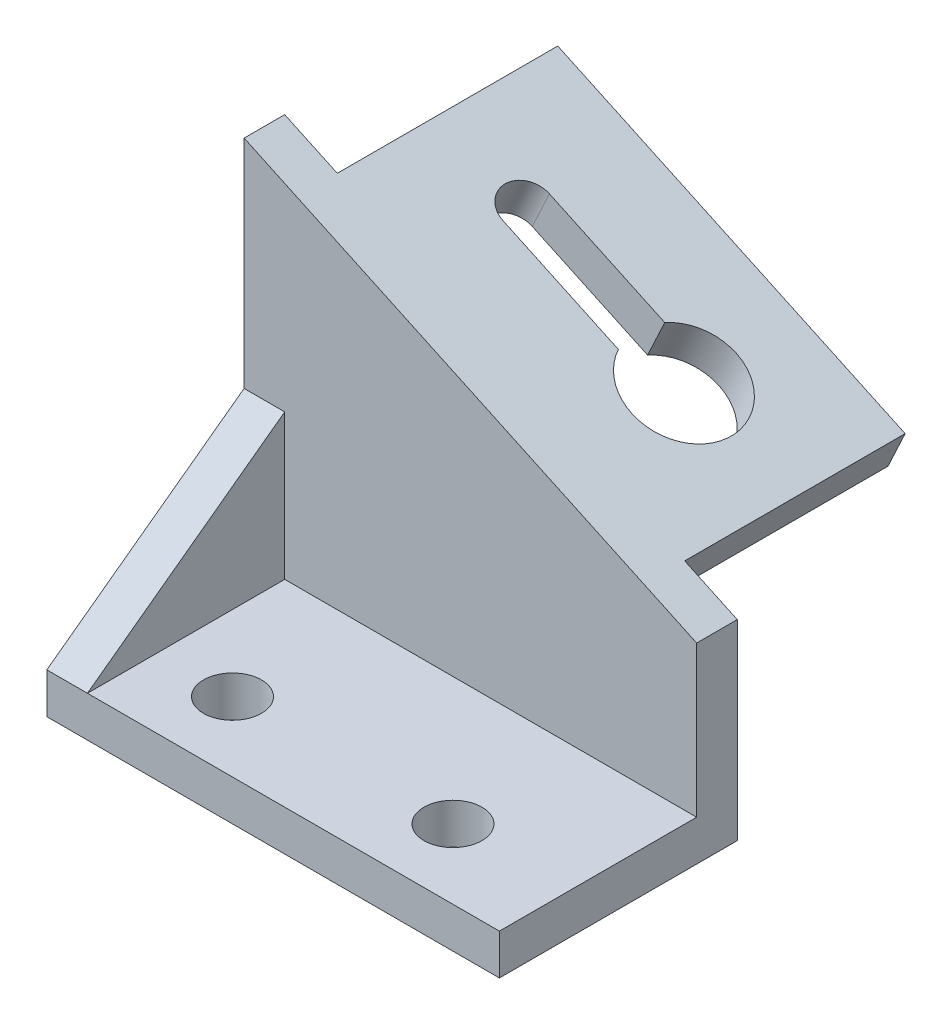
ISO-10303-21;
HEADER;
FILE_DESCRIPTION(('STEP AP214'),'2;1');
FILE_NAME('part.step','',(''),(''),'','','');
FILE_SCHEMA(('AUTOMOTIVE_DESIGN { 1 0 10303 214 1 1 1 1 }'));
ENDSEC;
DATA;
#1=APPLICATION_CONTEXT('core data for automotive mechanical design processes');
#2=APPLICATION_PROTOCOL_DEFINITION('international standard','automotive_design',2000,#1);
#3=PRODUCT_CONTEXT('',#1,'mechanical');
#4=PRODUCT('Part','Part','',(#3));
#5=PRODUCT_RELATED_PRODUCT_CATEGORY('part','',(#4));
#6=PRODUCT_DEFINITION_FORMATION('','',#4);
#7=PRODUCT_DEFINITION_CONTEXT('part definition',#1,'design');
#8=PRODUCT_DEFINITION('design','',#6,#7);
#9=PRODUCT_DEFINITION_SHAPE('','',#8);
#10=(LENGTH_UNIT() NAMED_UNIT(*) SI_UNIT(.MILLI.,.METRE.));
#11=(NAMED_UNIT(*) PLANE_ANGLE_UNIT() SI_UNIT($,.RADIAN.));
#12=(NAMED_UNIT(*) SI_UNIT($,.STERADIAN.) SOLID_ANGLE_UNIT());
#13=UNCERTAINTY_MEASURE_WITH_UNIT(LENGTH_MEASURE(1.E-05),#10,'distance_accuracy_value','');
#14=(GEOMETRIC_REPRESENTATION_CONTEXT(3) GLOBAL_UNCERTAINTY_ASSIGNED_CONTEXT((#13)) GLOBAL_UNIT_ASSIGNED_CONTEXT((#10,
#11,#12)) REPRESENTATION_CONTEXT('',''));
#15=CARTESIAN_POINT('',(0.,0.,0.));
#16=DIRECTION('',(0.,0.,1.));
#17=DIRECTION('',(1.,0.,0.));
#18=AXIS2_PLACEMENT_3D('',#15,#16,#17);
#19=CARTESIAN_POINT('',(0.,7.,-41.));
#20=DIRECTION('',(0.,0.,1.));
#21=DIRECTION('',(1.,0.,0.));
#22=AXIS2_PLACEMENT_3D('',#19,#20,#21);
#23=PLANE('',#22);
#24=DIRECTION('',(0.422618261740693,0.906307787036653,0.));
#25=VECTOR('',#24,1.);
#26=CARTESIAN_POINT('',(6.10475003818167,58.8016602094258,-41.));
#27=LINE('',#26,#25);
#28=CARTESIAN_POINT('',(6.10475003818167,58.8016602094258,-41.));
#29=VERTEX_POINT('',#28);
#30=CARTESIAN_POINT('',(9.06307787036652,65.1458147186824,-41.));
#31=VERTEX_POINT('',#30);
#32=EDGE_CURVE('E228',#29,#31,#27,.T.);
#33=ORIENTED_EDGE('',*,*,#32,.F.);
#34=DIRECTION('',(-0.906307787036653,0.422618261740693,0.));
#35=VECTOR('',#34,1.);
#36=CARTESIAN_POINT('',(23.6126887015027,50.6375743322113,-41.));
#37=LINE('',#36,#35);
#38=CARTESIAN_POINT('',(65.9785942974486,30.8820281081504,-41.));
#39=VERTEX_POINT('',#38);
#40=EDGE_CURVE('E198',#39,#29,#37,.T.);
#41=ORIENTED_EDGE('',*,*,#40,.F.);
#42=DIRECTION('',(0.422618261740693,0.906307787036653,0.));
#43=VECTOR('',#42,1.);
#44=CARTESIAN_POINT('',(65.9785942974486,30.8820281081504,-41.));
#45=LINE('',#44,#43);
#46=CARTESIAN_POINT('',(68.9369221296335,37.2261826174069,-41.));
#47=VERTEX_POINT('',#46);
#48=EDGE_CURVE('E240',#39,#47,#45,.T.);
#49=ORIENTED_EDGE('',*,*,#48,.T.);
#50=DIRECTION('',(-0.906307787036653,0.422618261740693,0.));
#51=VECTOR('',#50,1.);
#52=CARTESIAN_POINT('',(23.8898609827712,58.231972207565,-41.));
#53=LINE('',#52,#51);
#54=CARTESIAN_POINT('',(78.,33.,-41.));
#55=VERTEX_POINT('',#54);
#56=EDGE_CURVE('E255',#55,#47,#53,.T.);
#57=ORIENTED_EDGE('',*,*,#56,.F.);
#58=DIRECTION('',(0.,-1.,0.));
#59=VECTOR('',#58,1.);
#60=CARTESIAN_POINT('',(78.,7.,-41.));
#61=LINE('',#60,#59);
#62=CARTESIAN_POINT('',(78.,0.,-41.));
#63=VERTEX_POINT('',#62);
#64=EDGE_CURVE('E334',#55,#63,#61,.T.);
#65=ORIENTED_EDGE('',*,*,#64,.T.);
#66=DIRECTION('',(-1.,0.,0.));
#67=VECTOR('',#66,1.);
#68=CARTESIAN_POINT('',(0.,0.,-41.));
#69=LINE('',#68,#67);
#70=CARTESIAN_POINT('',(0.,0.,-41.));
#71=VERTEX_POINT('',#70);
#72=EDGE_CURVE('E328',#63,#71,#69,.T.);
#73=ORIENTED_EDGE('',*,*,#72,.T.);
#74=DIRECTION('',(0.,-1.,0.));
#75=VECTOR('',#74,1.);
#76=CARTESIAN_POINT('',(0.,7.,-41.));
#77=LINE('',#76,#75);
#78=CARTESIAN_POINT('',(0.,69.3719973360893,-41.));
#79=VERTEX_POINT('',#78);
#80=EDGE_CURVE('E319',#79,#71,#77,.T.);
#81=ORIENTED_EDGE('',*,*,#80,.F.);
#82=EDGE_CURVE('E232',#31,#79,#53,.T.);
#83=ORIENTED_EDGE('',*,*,#82,.F.);
#84=EDGE_LOOP('',(#33,#41,#49,#57,#65,#73,#81,#83));
#85=FACE_BOUND('',#84,.T.);
#86=ADVANCED_FACE('F45',(#85),#23,.F.);
#87=CARTESIAN_POINT('',(0.,7.,0.));
#88=DIRECTION('',(0.,-1.,0.));
#89=DIRECTION('',(0.,0.,-1.));
#90=AXIS2_PLACEMENT_3D('',#87,#88,#89);
#91=PLANE('',#90);
#92=CARTESIAN_POINT('',(58.,7.,-12.));
#93=DIRECTION('',(0.,1.,0.));
#94=DIRECTION('',(0.,0.,1.));
#95=AXIS2_PLACEMENT_3D('',#92,#93,#94);
#96=CIRCLE('',#95,5.);
#97=CARTESIAN_POINT('',(58.,7.,-7.));
#98=VERTEX_POINT('',#97);
#99=EDGE_CURVE('E294',#98,#98,#96,.T.);
#100=ORIENTED_EDGE('',*,*,#99,.F.);
#101=EDGE_LOOP('',(#100));
#102=FACE_BOUND('',#101,.T.);
#103=CARTESIAN_POINT('',(20.,7.,-12.));
#104=DIRECTION('',(0.,1.,0.));
#105=DIRECTION('',(0.,0.,1.));
#106=AXIS2_PLACEMENT_3D('',#103,#104,#105);
#107=CIRCLE('',#106,5.);
#108=CARTESIAN_POINT('',(20.,7.,-7.));
#109=VERTEX_POINT('',#108);
#110=EDGE_CURVE('E302',#109,#109,#107,.T.);
#111=ORIENTED_EDGE('',*,*,#110,.F.);
#112=EDGE_LOOP('',(#111));
#113=FACE_BOUND('',#112,.T.);
#114=DIRECTION('',(0.,0.,-1.));
#115=VECTOR('',#114,1.);
#116=CARTESIAN_POINT('',(78.,7.,0.));
#117=LINE('',#116,#115);
#118=CARTESIAN_POINT('',(78.,7.,0.));
#119=VERTEX_POINT('',#118);
#120=CARTESIAN_POINT('',(78.,7.,-34.));
#121=VERTEX_POINT('',#120);
#122=EDGE_CURVE('E314',#119,#121,#117,.T.);
#123=ORIENTED_EDGE('',*,*,#122,.T.);
#124=DIRECTION('',(-1.,0.,0.));
#125=VECTOR('',#124,1.);
#126=CARTESIAN_POINT('',(0.,7.,-34.));
#127=LINE('',#126,#125);
#128=CARTESIAN_POINT('',(7.,7.,-34.));
#129=VERTEX_POINT('',#128);
#130=EDGE_CURVE('E272',#121,#129,#127,.T.);
#131=ORIENTED_EDGE('',*,*,#130,.T.);
#132=DIRECTION('',(0.,0.,-1.));
#133=VECTOR('',#132,1.);
#134=CARTESIAN_POINT('',(7.,7.,-34.));
#135=LINE('',#134,#133);
#136=CARTESIAN_POINT('',(7.,7.,0.));
#137=VERTEX_POINT('',#136);
#138=EDGE_CURVE('E69',#137,#129,#135,.T.);
#139=ORIENTED_EDGE('',*,*,#138,.F.);
#140=DIRECTION('',(1.,0.,0.));
#141=VECTOR('',#140,1.);
#142=CARTESIAN_POINT('',(0.,7.,0.));
#143=LINE('',#142,#141);
#144=EDGE_CURVE('E315',#137,#119,#143,.T.);
#145=ORIENTED_EDGE('',*,*,#144,.T.);
#146=EDGE_LOOP('',(#123,#131,#139,#145));
#147=FACE_BOUND('',#146,.T.);
#148=ADVANCED_FACE('F368',(#102,#113,#147),#91,.F.);
#149=CARTESIAN_POINT('',(0.,0.,0.));
#150=DIRECTION('',(0.,-1.,0.));
#151=DIRECTION('',(0.,0.,-1.));
#152=AXIS2_PLACEMENT_3D('',#149,#150,#151);
#153=PLANE('',#152);
#154=DIRECTION('',(1.,0.,0.));
#155=VECTOR('',#154,1.);
#156=CARTESIAN_POINT('',(0.,0.,0.));
#157=LINE('',#156,#155);
#158=CARTESIAN_POINT('',(0.,0.,0.));
#159=VERTEX_POINT('',#158);
#160=CARTESIAN_POINT('',(78.,0.,0.));
#161=VERTEX_POINT('',#160);
#162=EDGE_CURVE('E322',#159,#161,#157,.T.);
#163=ORIENTED_EDGE('',*,*,#162,.F.);
#164=DIRECTION('',(0.,0.,1.));
#165=VECTOR('',#164,1.);
#166=CARTESIAN_POINT('',(0.,0.,0.));
#167=LINE('',#166,#165);
#168=EDGE_CURVE('E306',#71,#159,#167,.T.);
#169=ORIENTED_EDGE('',*,*,#168,.F.);
#170=ORIENTED_EDGE('',*,*,#72,.F.);
#171=DIRECTION('',(0.,0.,-1.));
#172=VECTOR('',#171,1.);
#173=CARTESIAN_POINT('',(78.,0.,0.));
#174=LINE('',#173,#172);
#175=EDGE_CURVE('E325',#161,#63,#174,.T.);
#176=ORIENTED_EDGE('',*,*,#175,.F.);
#177=EDGE_LOOP('',(#163,#169,#170,#176));
#178=FACE_BOUND('',#177,.T.);
#179=CARTESIAN_POINT('',(20.,0.,-12.));
#180=DIRECTION('',(0.,1.,0.));
#181=DIRECTION('',(0.,0.,1.));
#182=AXIS2_PLACEMENT_3D('',#179,#180,#181);
#183=CIRCLE('',#182,5.);
#184=CARTESIAN_POINT('',(20.,0.,-7.));
#185=VERTEX_POINT('',#184);
#186=EDGE_CURVE('E298',#185,#185,#183,.T.);
#187=ORIENTED_EDGE('',*,*,#186,.T.);
#188=EDGE_LOOP('',(#187));
#189=FACE_BOUND('',#188,.T.);
#190=CARTESIAN_POINT('',(58.,0.,-12.));
#191=DIRECTION('',(0.,1.,0.));
#192=DIRECTION('',(0.,0.,1.));
#193=AXIS2_PLACEMENT_3D('',#190,#191,#192);
#194=CIRCLE('',#193,5.);
#195=CARTESIAN_POINT('',(58.,0.,-7.));
#196=VERTEX_POINT('',#195);
#197=EDGE_CURVE('E293',#196,#196,#194,.T.);
#198=ORIENTED_EDGE('',*,*,#197,.T.);
#199=EDGE_LOOP('',(#198));
#200=FACE_BOUND('',#199,.T.);
#201=ADVANCED_FACE('F349',(#178,#189,#200),#153,.T.);
#202=CARTESIAN_POINT('',(0.,7.,0.));
#203=DIRECTION('',(1.,0.,0.));
#204=DIRECTION('',(0.,0.,-1.));
#205=AXIS2_PLACEMENT_3D('',#202,#203,#204);
#206=PLANE('',#205);
#207=DIRECTION('',(0.,-0.592390450477518,0.805651012649425));
#208=VECTOR('',#207,1.);
#209=CARTESIAN_POINT('',(0.,7.,0.));
#210=LINE('',#209,#208);
#211=CARTESIAN_POINT('',(0.,32.,-34.));
#212=VERTEX_POINT('',#211);
#213=CARTESIAN_POINT('',(0.,7.,0.));
#214=VERTEX_POINT('',#213);
#215=EDGE_CURVE('E275',#212,#214,#210,.T.);
#216=ORIENTED_EDGE('',*,*,#215,.F.);
#217=DIRECTION('',(0.,-1.,0.));
#218=VECTOR('',#217,1.);
#219=CARTESIAN_POINT('',(0.,7.,-34.));
#220=LINE('',#219,#218);
#221=CARTESIAN_POINT('',(0.,69.3719973360893,-34.));
#222=VERTEX_POINT('',#221);
#223=EDGE_CURVE('E254',#222,#212,#220,.T.);
#224=ORIENTED_EDGE('',*,*,#223,.F.);
#225=DIRECTION('',(0.,0.,-1.));
#226=VECTOR('',#225,1.);
#227=CARTESIAN_POINT('',(0.,69.3719973360893,-34.));
#228=LINE('',#227,#226);
#229=EDGE_CURVE('E268',#222,#79,#228,.T.);
#230=ORIENTED_EDGE('',*,*,#229,.T.);
#231=ORIENTED_EDGE('',*,*,#80,.T.);
#232=ORIENTED_EDGE('',*,*,#168,.T.);
#233=DIRECTION('',(0.,-1.,0.));
#234=VECTOR('',#233,1.);
#235=CARTESIAN_POINT('',(0.,7.,0.));
#236=LINE('',#235,#234);
#237=EDGE_CURVE('E11',#214,#159,#236,.T.);
#238=ORIENTED_EDGE('',*,*,#237,.F.);
#239=EDGE_LOOP('',(#216,#224,#230,#231,#232,#238));
#240=FACE_BOUND('',#239,.T.);
#241=ADVANCED_FACE('F47',(#240),#206,.F.);
#242=CARTESIAN_POINT('',(0.,7.,0.));
#243=DIRECTION('',(0.,0.,-1.));
#244=DIRECTION('',(-1.,0.,0.));
#245=AXIS2_PLACEMENT_3D('',#242,#243,#244);
#246=PLANE('',#245);
#247=ORIENTED_EDGE('',*,*,#162,.T.);
#248=DIRECTION('',(0.,-1.,0.));
#249=VECTOR('',#248,1.);
#250=CARTESIAN_POINT('',(78.,7.,0.));
#251=LINE('',#250,#249);
#252=EDGE_CURVE('E54',#119,#161,#251,.T.);
#253=ORIENTED_EDGE('',*,*,#252,.F.);
#254=ORIENTED_EDGE('',*,*,#144,.F.);
#255=EDGE_CURVE('E310',#214,#137,#143,.T.);
#256=ORIENTED_EDGE('',*,*,#255,.F.);
#257=ORIENTED_EDGE('',*,*,#237,.T.);
#258=EDGE_LOOP('',(#247,#253,#254,#256,#257));
#259=FACE_BOUND('',#258,.T.);
#260=ADVANCED_FACE('F369',(#259),#246,.F.);
#261=CARTESIAN_POINT('',(78.,7.,0.));
#262=DIRECTION('',(-1.,0.,0.));
#263=DIRECTION('',(0.,0.,1.));
#264=AXIS2_PLACEMENT_3D('',#261,#262,#263);
#265=PLANE('',#264);
#266=ORIENTED_EDGE('',*,*,#175,.T.);
#267=ORIENTED_EDGE('',*,*,#64,.F.);
#268=DIRECTION('',(0.,0.,-1.));
#269=VECTOR('',#268,1.);
#270=CARTESIAN_POINT('',(78.,33.,-34.));
#271=LINE('',#270,#269);
#272=CARTESIAN_POINT('',(78.,33.,-34.));
#273=VERTEX_POINT('',#272);
#274=EDGE_CURVE('E261',#273,#55,#271,.T.);
#275=ORIENTED_EDGE('',*,*,#274,.F.);
#276=DIRECTION('',(0.,1.,0.));
#277=VECTOR('',#276,1.);
#278=CARTESIAN_POINT('',(78.,7.,-34.));
#279=LINE('',#278,#277);
#280=EDGE_CURVE('E258',#121,#273,#279,.T.);
#281=ORIENTED_EDGE('',*,*,#280,.F.);
#282=ORIENTED_EDGE('',*,*,#122,.F.);
#283=ORIENTED_EDGE('',*,*,#252,.T.);
#284=EDGE_LOOP('',(#266,#267,#275,#281,#282,#283));
#285=FACE_BOUND('',#284,.T.);
#286=ADVANCED_FACE('F343',(#285),#265,.F.);
#287=CARTESIAN_POINT('',(20.,7.,-12.));
#288=DIRECTION('',(0.,-1.,0.));
#289=DIRECTION('',(0.,0.,-1.));
#290=AXIS2_PLACEMENT_3D('',#287,#288,#289);
#291=CYLINDRICAL_SURFACE('',#290,5.);
#292=ORIENTED_EDGE('',*,*,#110,.T.);
#293=EDGE_LOOP('',(#292));
#294=FACE_BOUND('',#293,.T.);
#295=ORIENTED_EDGE('',*,*,#186,.F.);
#296=EDGE_LOOP('',(#295));
#297=FACE_BOUND('',#296,.T.);
#298=ADVANCED_FACE('F408',(#294,#297),#291,.F.);
#299=CARTESIAN_POINT('',(58.,7.,-12.));
#300=DIRECTION('',(0.,-1.,0.));
#301=DIRECTION('',(0.,0.,-1.));
#302=AXIS2_PLACEMENT_3D('',#299,#300,#301);
#303=CYLINDRICAL_SURFACE('',#302,5.);
#304=ORIENTED_EDGE('',*,*,#99,.T.);
#305=EDGE_LOOP('',(#304));
#306=FACE_BOUND('',#305,.T.);
#307=ORIENTED_EDGE('',*,*,#197,.F.);
#308=EDGE_LOOP('',(#307));
#309=FACE_BOUND('',#308,.T.);
#310=ADVANCED_FACE('F433',(#306,#309),#303,.F.);
#311=CARTESIAN_POINT('',(7.,7.,0.));
#312=DIRECTION('',(0.,-0.805651012649424,-0.592390450477518));
#313=DIRECTION('',(0.,0.592390450477518,-0.805651012649425));
#314=AXIS2_PLACEMENT_3D('',#311,#312,#313);
#315=PLANE('',#314);
#316=ORIENTED_EDGE('',*,*,#215,.T.);
#317=ORIENTED_EDGE('',*,*,#255,.T.);
#318=DIRECTION('',(0.,-0.592390450477518,0.805651012649425));
#319=VECTOR('',#318,1.);
#320=CARTESIAN_POINT('',(7.,7.,0.));
#321=LINE('',#320,#319);
#322=CARTESIAN_POINT('',(7.,32.,-34.));
#323=VERTEX_POINT('',#322);
#324=EDGE_CURVE('E282',#323,#137,#321,.T.);
#325=ORIENTED_EDGE('',*,*,#324,.F.);
#326=DIRECTION('',(-1.,0.,0.));
#327=VECTOR('',#326,1.);
#328=CARTESIAN_POINT('',(7.,32.,-34.));
#329=LINE('',#328,#327);
#330=EDGE_CURVE('E286',#323,#212,#329,.T.);
#331=ORIENTED_EDGE('',*,*,#330,.T.);
#332=EDGE_LOOP('',(#316,#317,#325,#331));
#333=FACE_BOUND('',#332,.T.);
#334=ADVANCED_FACE('F374',(#333),#315,.F.);
#335=CARTESIAN_POINT('',(7.,0.,0.));
#336=DIRECTION('',(1.,0.,0.));
#337=DIRECTION('',(0.,0.,-1.));
#338=AXIS2_PLACEMENT_3D('',#335,#336,#337);
#339=PLANE('',#338);
#340=ORIENTED_EDGE('',*,*,#138,.T.);
#341=DIRECTION('',(0.,1.,0.));
#342=VECTOR('',#341,1.);
#343=CARTESIAN_POINT('',(7.,32.,-34.));
#344=LINE('',#343,#342);
#345=EDGE_CURVE('E278',#129,#323,#344,.T.);
#346=ORIENTED_EDGE('',*,*,#345,.T.);
#347=ORIENTED_EDGE('',*,*,#324,.T.);
#348=EDGE_LOOP('',(#340,#346,#347));
#349=FACE_BOUND('',#348,.T.);
#350=ADVANCED_FACE('F372',(#349),#339,.T.);
#351=CARTESIAN_POINT('',(0.,0.,-34.));
#352=DIRECTION('',(0.,0.,1.));
#353=DIRECTION('',(1.,0.,0.));
#354=AXIS2_PLACEMENT_3D('',#351,#352,#353);
#355=PLANE('',#354);
#356=ORIENTED_EDGE('',*,*,#130,.F.);
#357=ORIENTED_EDGE('',*,*,#280,.T.);
#358=DIRECTION('',(-0.906307787036653,0.422618261740693,0.));
#359=VECTOR('',#358,1.);
#360=CARTESIAN_POINT('',(23.8898609827712,58.231972207565,-34.));
#361=LINE('',#360,#359);
#362=EDGE_CURVE('E250',#273,#222,#361,.T.);
#363=ORIENTED_EDGE('',*,*,#362,.T.);
#364=ORIENTED_EDGE('',*,*,#223,.T.);
#365=ORIENTED_EDGE('',*,*,#330,.F.);
#366=ORIENTED_EDGE('',*,*,#345,.F.);
#367=EDGE_LOOP('',(#356,#357,#363,#364,#365,#366));
#368=FACE_BOUND('',#367,.T.);
#369=ADVANCED_FACE('F376',(#368),#355,.T.);
#370=CARTESIAN_POINT('',(23.8898609827712,58.231972207565,-34.));
#371=DIRECTION('',(-0.422618261740693,-0.906307787036653,0.));
#372=DIRECTION('',(0.906307787036653,-0.422618261740693,0.));
#373=AXIS2_PLACEMENT_3D('',#370,#371,#372);
#374=PLANE('',#373);
#375=ORIENTED_EDGE('',*,*,#56,.T.);
#376=DIRECTION('',(0.,0.,-1.));
#377=VECTOR('',#376,1.);
#378=CARTESIAN_POINT('',(68.9369221296335,37.226182617407,0.));
#379=LINE('',#378,#377);
#380=CARTESIAN_POINT('',(68.9369221296335,37.226182617407,-79.));
#381=VERTEX_POINT('',#380);
#382=EDGE_CURVE('E61',#47,#381,#379,.T.);
#383=ORIENTED_EDGE('',*,*,#382,.T.);
#384=DIRECTION('',(0.906307787036653,-0.422618261740693,0.));
#385=VECTOR('',#384,1.);
#386=CARTESIAN_POINT('',(26.5710165336876,56.9817288414679,-79.));
#387=LINE('',#386,#385);
#388=CARTESIAN_POINT('',(9.06307787036654,65.1458147186823,-79.));
#389=VERTEX_POINT('',#388);
#390=EDGE_CURVE('E190',#389,#381,#387,.T.);
#391=ORIENTED_EDGE('',*,*,#390,.F.);
#392=DIRECTION('',(0.,0.,-1.));
#393=VECTOR('',#392,1.);
#394=CARTESIAN_POINT('',(9.06307787036653,65.1458147186823,0.));
#395=LINE('',#394,#393);
#396=EDGE_CURVE('E187',#31,#389,#395,.T.);
#397=ORIENTED_EDGE('',*,*,#396,.F.);
#398=ORIENTED_EDGE('',*,*,#82,.T.);
#399=ORIENTED_EDGE('',*,*,#229,.F.);
#400=ORIENTED_EDGE('',*,*,#362,.F.);
#401=ORIENTED_EDGE('',*,*,#274,.T.);
#402=EDGE_LOOP('',(#375,#383,#391,#397,#398,#399,#400,#401));
#403=FACE_BOUND('',#402,.T.);
#404=CARTESIAN_POINT('',(23.6215327778008,58.3570957044416,-59.));
#405=DIRECTION('',(0.422618261740693,0.906307787036653,0.));
#406=DIRECTION('',(-0.906307787036653,0.422618261740693,0.));
#407=AXIS2_PLACEMENT_3D('',#404,#405,#406);
#408=CIRCLE('',#407,4.);
#409=CARTESIAN_POINT('',(23.6215327778008,58.3570957044416,-63.));
#410=VERTEX_POINT('',#409);
#411=CARTESIAN_POINT('',(23.6215327778008,58.3570957044416,-55.));
#412=VERTEX_POINT('',#411);
#413=EDGE_CURVE('E211',#410,#412,#408,.T.);
#414=ORIENTED_EDGE('',*,*,#413,.F.);
#415=DIRECTION('',(-0.906307787036653,0.422618261740693,0.));
#416=VECTOR('',#415,1.);
#417=CARTESIAN_POINT('',(26.5710165336876,56.9817288414679,-63.));
#418=LINE('',#417,#416);
#419=CARTESIAN_POINT('',(43.5038794105209,49.0858052075122,-63.));
#420=VERTEX_POINT('',#419);
#421=EDGE_CURVE('E175',#420,#410,#418,.T.);
#422=ORIENTED_EDGE('',*,*,#421,.F.);
#423=CARTESIAN_POINT('',(50.8107663889004,45.6785478522208,-59.));
#424=DIRECTION('',(0.422618261740693,0.906307787036653,0.));
#425=DIRECTION('',(-0.906307787036653,0.422618261740693,0.));
#426=AXIS2_PLACEMENT_3D('',#423,#424,#425);
#427=CIRCLE('',#426,9.);
#428=CARTESIAN_POINT('',(43.5038794105209,49.0858052075122,-55.));
#429=VERTEX_POINT('',#428);
#430=EDGE_CURVE('E216',#429,#420,#427,.T.);
#431=ORIENTED_EDGE('',*,*,#430,.F.);
#432=DIRECTION('',(-0.906307787036653,0.422618261740693,0.));
#433=VECTOR('',#432,1.);
#434=CARTESIAN_POINT('',(26.5710165336876,56.9817288414679,-55.));
#435=LINE('',#434,#433);
#436=EDGE_CURVE('E219',#429,#412,#435,.T.);
#437=ORIENTED_EDGE('',*,*,#436,.T.);
#438=EDGE_LOOP('',(#414,#422,#431,#437));
#439=FACE_BOUND('',#438,.T.);
#440=ADVANCED_FACE('F363',(#403,#439),#374,.F.);
#441=CARTESIAN_POINT('',(6.10475003818168,58.8016602094258,0.));
#442=DIRECTION('',(0.906307787036653,-0.422618261740693,0.));
#443=DIRECTION('',(0.422618261740693,0.906307787036653,0.));
#444=AXIS2_PLACEMENT_3D('',#441,#442,#443);
#445=PLANE('',#444);
#446=ORIENTED_EDGE('',*,*,#396,.T.);
#447=DIRECTION('',(0.422618261740693,0.906307787036653,0.));
#448=VECTOR('',#447,1.);
#449=CARTESIAN_POINT('',(6.10475003818168,58.8016602094258,-79.));
#450=LINE('',#449,#448);
#451=CARTESIAN_POINT('',(6.10475003818168,58.8016602094258,-79.));
#452=VERTEX_POINT('',#451);
#453=EDGE_CURVE('E233',#452,#389,#450,.T.);
#454=ORIENTED_EDGE('',*,*,#453,.F.);
#455=DIRECTION('',(0.,0.,-1.));
#456=VECTOR('',#455,1.);
#457=CARTESIAN_POINT('',(6.10475003818168,58.8016602094258,0.));
#458=LINE('',#457,#456);
#459=EDGE_CURVE('E181',#29,#452,#458,.T.);
#460=ORIENTED_EDGE('',*,*,#459,.F.);
#461=ORIENTED_EDGE('',*,*,#32,.T.);
#462=EDGE_LOOP('',(#446,#454,#460,#461));
#463=FACE_BOUND('',#462,.T.);
#464=ADVANCED_FACE('F387',(#463),#445,.F.);
#465=CARTESIAN_POINT('',(23.6126887015027,50.6375743322113,-79.));
#466=DIRECTION('',(0.,0.,1.));
#467=DIRECTION('',(1.,0.,0.));
#468=AXIS2_PLACEMENT_3D('',#465,#466,#467);
#469=PLANE('',#468);
#470=ORIENTED_EDGE('',*,*,#390,.T.);
#471=DIRECTION('',(0.422618261740693,0.906307787036653,0.));
#472=VECTOR('',#471,1.);
#473=CARTESIAN_POINT('',(65.9785942974486,30.8820281081504,-79.));
#474=LINE('',#473,#472);
#475=CARTESIAN_POINT('',(65.9785942974486,30.8820281081504,-79.));
#476=VERTEX_POINT('',#475);
#477=EDGE_CURVE('E237',#476,#381,#474,.T.);
#478=ORIENTED_EDGE('',*,*,#477,.F.);
#479=DIRECTION('',(0.906307787036653,-0.422618261740693,0.));
#480=VECTOR('',#479,1.);
#481=CARTESIAN_POINT('',(23.6126887015027,50.6375743322113,-79.));
#482=LINE('',#481,#480);
#483=EDGE_CURVE('E206',#452,#476,#482,.T.);
#484=ORIENTED_EDGE('',*,*,#483,.F.);
#485=ORIENTED_EDGE('',*,*,#453,.T.);
#486=EDGE_LOOP('',(#470,#478,#484,#485));
#487=FACE_BOUND('',#486,.T.);
#488=ADVANCED_FACE('F385',(#487),#469,.F.);
#489=CARTESIAN_POINT('',(20.663204945616,52.0129411951851,-59.));
#490=DIRECTION('',(0.422618261740693,0.906307787036653,0.));
#491=DIRECTION('',(-0.906307787036653,0.422618261740693,0.));
#492=AXIS2_PLACEMENT_3D('',#489,#490,#491);
#493=CYLINDRICAL_SURFACE('',#492,4.);
#494=ORIENTED_EDGE('',*,*,#413,.T.);
#495=DIRECTION('',(0.422618261740693,0.906307787036653,0.));
#496=VECTOR('',#495,1.);
#497=CARTESIAN_POINT('',(20.663204945616,52.0129411951851,-55.));
#498=LINE('',#497,#496);
#499=CARTESIAN_POINT('',(20.663204945616,52.0129411951851,-55.));
#500=VERTEX_POINT('',#499);
#501=EDGE_CURVE('E184',#500,#412,#498,.T.);
#502=ORIENTED_EDGE('',*,*,#501,.F.);
#503=CARTESIAN_POINT('',(20.663204945616,52.0129411951851,-59.));
#504=DIRECTION('',(0.422618261740693,0.906307787036653,0.));
#505=DIRECTION('',(-0.906307787036653,0.422618261740693,0.));
#506=AXIS2_PLACEMENT_3D('',#503,#504,#505);
#507=CIRCLE('',#506,4.);
#508=CARTESIAN_POINT('',(20.663204945616,52.012941195185,-63.));
#509=VERTEX_POINT('',#508);
#510=EDGE_CURVE('E162',#509,#500,#507,.T.);
#511=ORIENTED_EDGE('',*,*,#510,.F.);
#512=DIRECTION('',(0.422618261740693,0.906307787036653,0.));
#513=VECTOR('',#512,1.);
#514=CARTESIAN_POINT('',(20.663204945616,52.012941195185,-63.));
#515=LINE('',#514,#513);
#516=EDGE_CURVE('E172',#509,#410,#515,.T.);
#517=ORIENTED_EDGE('',*,*,#516,.T.);
#518=EDGE_LOOP('',(#494,#502,#511,#517));
#519=FACE_BOUND('',#518,.T.);
#520=ADVANCED_FACE('F183',(#519),#493,.F.);
#521=CARTESIAN_POINT('',(23.6126887015027,50.6375743322113,-55.));
#522=DIRECTION('',(0.,0.,-1.));
#523=DIRECTION('',(-1.,0.,0.));
#524=AXIS2_PLACEMENT_3D('',#521,#522,#523);
#525=PLANE('',#524);
#526=ORIENTED_EDGE('',*,*,#436,.F.);
#527=DIRECTION('',(0.422618261740693,0.906307787036653,0.));
#528=VECTOR('',#527,1.);
#529=CARTESIAN_POINT('',(40.545551578336,42.7416506982556,-55.));
#530=LINE('',#529,#528);
#531=CARTESIAN_POINT('',(40.545551578336,42.7416506982556,-55.));
#532=VERTEX_POINT('',#531);
#533=EDGE_CURVE('E245',#532,#429,#530,.T.);
#534=ORIENTED_EDGE('',*,*,#533,.F.);
#535=DIRECTION('',(-0.906307787036653,0.422618261740693,0.));
#536=VECTOR('',#535,1.);
#537=CARTESIAN_POINT('',(23.6126887015027,50.6375743322113,-55.));
#538=LINE('',#537,#536);
#539=EDGE_CURVE('E195',#532,#500,#538,.T.);
#540=ORIENTED_EDGE('',*,*,#539,.T.);
#541=ORIENTED_EDGE('',*,*,#501,.T.);
#542=EDGE_LOOP('',(#526,#534,#540,#541));
#543=FACE_BOUND('',#542,.T.);
#544=ADVANCED_FACE('F481',(#543),#525,.T.);
#545=CARTESIAN_POINT('',(47.8524385567156,39.3343933429643,-59.));
#546=DIRECTION('',(0.422618261740693,0.906307787036653,0.));
#547=DIRECTION('',(-0.906307787036653,0.422618261740693,0.));
#548=AXIS2_PLACEMENT_3D('',#545,#546,#547);
#549=CYLINDRICAL_SURFACE('',#548,9.);
#550=ORIENTED_EDGE('',*,*,#430,.T.);
#551=DIRECTION('',(0.422618261740693,0.906307787036653,0.));
#552=VECTOR('',#551,1.);
#553=CARTESIAN_POINT('',(40.545551578336,42.7416506982556,-63.));
#554=LINE('',#553,#552);
#555=CARTESIAN_POINT('',(40.545551578336,42.7416506982556,-63.));
#556=VERTEX_POINT('',#555);
#557=EDGE_CURVE('E180',#556,#420,#554,.T.);
#558=ORIENTED_EDGE('',*,*,#557,.F.);
#559=CARTESIAN_POINT('',(47.8524385567156,39.3343933429643,-59.));
#560=DIRECTION('',(0.422618261740693,0.906307787036653,0.));
#561=DIRECTION('',(-0.906307787036653,0.422618261740693,0.));
#562=AXIS2_PLACEMENT_3D('',#559,#560,#561);
#563=CIRCLE('',#562,9.);
#564=EDGE_CURVE('E165',#532,#556,#563,.T.);
#565=ORIENTED_EDGE('',*,*,#564,.F.);
#566=ORIENTED_EDGE('',*,*,#533,.T.);
#567=EDGE_LOOP('',(#550,#558,#565,#566));
#568=FACE_BOUND('',#567,.T.);
#569=ADVANCED_FACE('F489',(#568),#549,.F.);
#570=CARTESIAN_POINT('',(23.6126887015027,50.6375743322113,-63.));
#571=DIRECTION('',(0.,0.,-1.));
#572=DIRECTION('',(-1.,0.,0.));
#573=AXIS2_PLACEMENT_3D('',#570,#571,#572);
#574=PLANE('',#573);
#575=ORIENTED_EDGE('',*,*,#421,.T.);
#576=ORIENTED_EDGE('',*,*,#516,.F.);
#577=DIRECTION('',(-0.906307787036653,0.422618261740693,0.));
#578=VECTOR('',#577,1.);
#579=CARTESIAN_POINT('',(23.6126887015027,50.6375743322113,-63.));
#580=LINE('',#579,#578);
#581=EDGE_CURVE('E156',#556,#509,#580,.T.);
#582=ORIENTED_EDGE('',*,*,#581,.F.);
#583=ORIENTED_EDGE('',*,*,#557,.T.);
#584=EDGE_LOOP('',(#575,#576,#582,#583));
#585=FACE_BOUND('',#584,.T.);
#586=ADVANCED_FACE('F173',(#585),#574,.F.);
#587=CARTESIAN_POINT('',(65.9785942974486,30.8820281081504,0.));
#588=DIRECTION('',(0.906307787036653,-0.422618261740693,0.));
#589=DIRECTION('',(0.422618261740693,0.906307787036653,0.));
#590=AXIS2_PLACEMENT_3D('',#587,#588,#589);
#591=PLANE('',#590);
#592=ORIENTED_EDGE('',*,*,#382,.F.);
#593=ORIENTED_EDGE('',*,*,#48,.F.);
#594=DIRECTION('',(0.,0.,-1.));
#595=VECTOR('',#594,1.);
#596=CARTESIAN_POINT('',(65.9785942974486,30.8820281081504,0.));
#597=LINE('',#596,#595);
#598=EDGE_CURVE('E202',#39,#476,#597,.T.);
#599=ORIENTED_EDGE('',*,*,#598,.T.);
#600=ORIENTED_EDGE('',*,*,#477,.T.);
#601=EDGE_LOOP('',(#592,#593,#599,#600));
#602=FACE_BOUND('',#601,.T.);
#603=ADVANCED_FACE('F380',(#602),#591,.T.);
#604=CARTESIAN_POINT('',(23.6126887015027,50.6375743322113,0.));
#605=DIRECTION('',(0.422618261740693,0.906307787036653,0.));
#606=DIRECTION('',(-0.906307787036653,0.422618261740693,0.));
#607=AXIS2_PLACEMENT_3D('',#604,#605,#606);
#608=PLANE('',#607);
#609=ORIENTED_EDGE('',*,*,#510,.T.);
#610=ORIENTED_EDGE('',*,*,#539,.F.);
#611=ORIENTED_EDGE('',*,*,#564,.T.);
#612=ORIENTED_EDGE('',*,*,#581,.T.);
#613=EDGE_LOOP('',(#609,#610,#611,#612));
#614=FACE_BOUND('',#613,.T.);
#615=ORIENTED_EDGE('',*,*,#40,.T.);
#616=ORIENTED_EDGE('',*,*,#459,.T.);
#617=ORIENTED_EDGE('',*,*,#483,.T.);
#618=ORIENTED_EDGE('',*,*,#598,.F.);
#619=EDGE_LOOP('',(#615,#616,#617,#618));
#620=FACE_BOUND('',#619,.T.);
#621=ADVANCED_FACE('F158',(#614,#620),#608,.F.);
#622=CLOSED_SHELL('',(#86,#148,#201,#241,#260,#286,#298,#310,#334,#350,#369,#440,#464,#488,#520,
#544,#569,#586,#603,#621));
#623=MANIFOLD_SOLID_BREP('B2',#622);
#624=ADVANCED_BREP_SHAPE_REPRESENTATION('',(#18,#623),#14);
#625=SHAPE_DEFINITION_REPRESENTATION(#9,#624);
ENDSEC;
END-ISO-10303-21;
